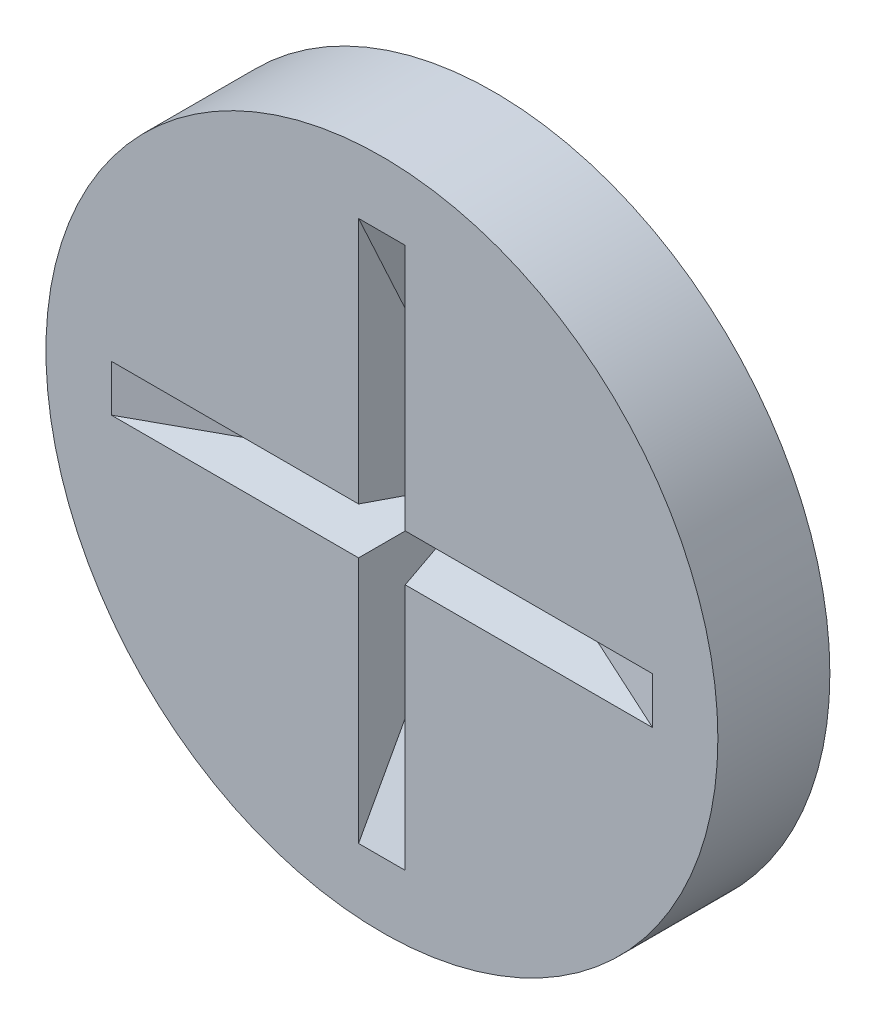
ISO-10303-21;
HEADER;
FILE_DESCRIPTION(('STEP AP214'),'2;1');
FILE_NAME('part.step','',(''),(''),'','','');
FILE_SCHEMA(('AUTOMOTIVE_DESIGN { 1 0 10303 214 1 1 1 1 }'));
ENDSEC;
DATA;
#1=APPLICATION_CONTEXT('core data for automotive mechanical design processes');
#2=APPLICATION_PROTOCOL_DEFINITION('international standard','automotive_design',2000,#1);
#3=PRODUCT_CONTEXT('',#1,'mechanical');
#4=PRODUCT('Part','Part','',(#3));
#5=PRODUCT_RELATED_PRODUCT_CATEGORY('part','',(#4));
#6=PRODUCT_DEFINITION_FORMATION('','',#4);
#7=PRODUCT_DEFINITION_CONTEXT('part definition',#1,'design');
#8=PRODUCT_DEFINITION('design','',#6,#7);
#9=PRODUCT_DEFINITION_SHAPE('','',#8);
#10=(LENGTH_UNIT() NAMED_UNIT(*) SI_UNIT(.MILLI.,.METRE.));
#11=(NAMED_UNIT(*) PLANE_ANGLE_UNIT() SI_UNIT($,.RADIAN.));
#12=(NAMED_UNIT(*) SI_UNIT($,.STERADIAN.) SOLID_ANGLE_UNIT());
#13=UNCERTAINTY_MEASURE_WITH_UNIT(LENGTH_MEASURE(1.E-05),#10,'distance_accuracy_value','');
#14=(GEOMETRIC_REPRESENTATION_CONTEXT(3) GLOBAL_UNCERTAINTY_ASSIGNED_CONTEXT((#13)) GLOBAL_UNIT_ASSIGNED_CONTEXT((#10,
#11,#12)) REPRESENTATION_CONTEXT('',''));
#15=CARTESIAN_POINT('',(0.,0.,0.));
#16=DIRECTION('',(0.,0.,1.));
#17=DIRECTION('',(1.,0.,0.));
#18=AXIS2_PLACEMENT_3D('',#15,#16,#17);
#19=CARTESIAN_POINT('',(0.,0.,1.2));
#20=DIRECTION('',(0.,0.,1.));
#21=DIRECTION('',(1.,0.,0.));
#22=AXIS2_PLACEMENT_3D('',#19,#20,#21);
#23=PLANE('',#22);
#24=CARTESIAN_POINT('',(0.,0.,1.2));
#25=DIRECTION('',(0.,0.,1.));
#26=DIRECTION('',(1.,0.,0.));
#27=AXIS2_PLACEMENT_3D('',#24,#25,#26);
#28=CIRCLE('',#27,3.6);
#29=CARTESIAN_POINT('',(3.6,0.,1.2));
#30=VERTEX_POINT('',#29);
#31=EDGE_CURVE('E48',#30,#30,#28,.T.);
#32=ORIENTED_EDGE('',*,*,#31,.T.);
#33=EDGE_LOOP('',(#32));
#34=FACE_BOUND('',#33,.T.);
#35=CARTESIAN_POINT('',(-2.9,0.25000000000001,1.2));
#36=DIRECTION('',(0.,-1.,0.));
#37=VECTOR('',#36,1.);
#38=LINE('',#35,#37);
#39=CARTESIAN_POINT('',(-2.9,0.25000000000001,1.2));
#40=VERTEX_POINT('',#39);
#41=CARTESIAN_POINT('',(-2.9,-0.24999999999999,1.2));
#42=VERTEX_POINT('',#41);
#43=EDGE_CURVE('E196',#40,#42,#38,.T.);
#44=ORIENTED_EDGE('',*,*,#43,.F.);
#45=DIRECTION('',(-1.,0.,0.));
#46=VECTOR('',#45,1.);
#47=CARTESIAN_POINT('',(2.9,0.24999999999999,1.2));
#48=LINE('',#47,#46);
#49=CARTESIAN_POINT('',(-0.249999999999998,0.250000000000002,1.2));
#50=VERTEX_POINT('',#49);
#51=EDGE_CURVE('E117',#50,#40,#48,.T.);
#52=ORIENTED_EDGE('',*,*,#51,.F.);
#53=DIRECTION('',(0.,-1.,0.));
#54=VECTOR('',#53,1.);
#55=CARTESIAN_POINT('',(-0.25,2.9,1.2));
#56=LINE('',#55,#54);
#57=CARTESIAN_POINT('',(-0.25,2.9,1.2));
#58=VERTEX_POINT('',#57);
#59=EDGE_CURVE('E150',#58,#50,#56,.T.);
#60=ORIENTED_EDGE('',*,*,#59,.F.);
#61=DIRECTION('',(-1.,0.,0.));
#62=VECTOR('',#61,1.);
#63=CARTESIAN_POINT('',(-0.25,2.9,1.2));
#64=LINE('',#63,#62);
#65=CARTESIAN_POINT('',(0.25,2.9,1.2));
#66=VERTEX_POINT('',#65);
#67=EDGE_CURVE('E126',#66,#58,#64,.T.);
#68=ORIENTED_EDGE('',*,*,#67,.F.);
#69=DIRECTION('',(0.,1.,0.));
#70=VECTOR('',#69,1.);
#71=CARTESIAN_POINT('',(0.25,2.9,1.2));
#72=LINE('',#71,#70);
#73=CARTESIAN_POINT('',(0.250000000000002,0.249999999999997,1.2));
#74=VERTEX_POINT('',#73);
#75=EDGE_CURVE('E65',#74,#66,#72,.T.);
#76=ORIENTED_EDGE('',*,*,#75,.F.);
#77=CARTESIAN_POINT('',(2.9,0.24999999999999,1.2));
#78=VERTEX_POINT('',#77);
#79=EDGE_CURVE('E110',#78,#74,#48,.T.);
#80=ORIENTED_EDGE('',*,*,#79,.F.);
#81=CARTESIAN_POINT('',(2.9,-0.25000000000001,1.2));
#82=DIRECTION('',(0.,1.,0.));
#83=VECTOR('',#82,1.);
#84=LINE('',#81,#83);
#85=CARTESIAN_POINT('',(2.9,-0.25000000000001,1.2));
#86=VERTEX_POINT('',#85);
#87=EDGE_CURVE('E204',#86,#78,#84,.T.);
#88=ORIENTED_EDGE('',*,*,#87,.F.);
#89=DIRECTION('',(1.,0.,0.));
#90=VECTOR('',#89,1.);
#91=CARTESIAN_POINT('',(2.9,-0.25000000000001,1.2));
#92=LINE('',#91,#90);
#93=CARTESIAN_POINT('',(0.249999999999999,-0.250000000000001,1.2));
#94=VERTEX_POINT('',#93);
#95=EDGE_CURVE('E213',#94,#86,#92,.T.);
#96=ORIENTED_EDGE('',*,*,#95,.F.);
#97=CARTESIAN_POINT('',(0.25,-2.9,1.2));
#98=VERTEX_POINT('',#97);
#99=EDGE_CURVE('E128',#98,#94,#72,.T.);
#100=ORIENTED_EDGE('',*,*,#99,.F.);
#101=DIRECTION('',(1.,0.,0.));
#102=VECTOR('',#101,1.);
#103=CARTESIAN_POINT('',(-0.25,-2.9,1.2));
#104=LINE('',#103,#102);
#105=CARTESIAN_POINT('',(-0.25,-2.9,1.2));
#106=VERTEX_POINT('',#105);
#107=EDGE_CURVE('E131',#106,#98,#104,.T.);
#108=ORIENTED_EDGE('',*,*,#107,.F.);
#109=CARTESIAN_POINT('',(-0.250000000000002,-0.249999999999997,1.2));
#110=VERTEX_POINT('',#109);
#111=EDGE_CURVE('E141',#110,#106,#56,.T.);
#112=ORIENTED_EDGE('',*,*,#111,.F.);
#113=EDGE_CURVE('E199',#42,#110,#92,.T.);
#114=ORIENTED_EDGE('',*,*,#113,.F.);
#115=EDGE_LOOP('',(#44,#52,#60,#68,#76,#80,#88,#96,#100,#108,#112,#114));
#116=FACE_BOUND('',#115,.T.);
#117=ADVANCED_FACE('F37',(#34,#116),#23,.T.);
#118=CARTESIAN_POINT('',(0.,0.,0.));
#119=DIRECTION('',(0.978980419737605,0.,0.203954254112001));
#120=DIRECTION('',(0.203954254112001,0.,-0.978980419737605));
#121=AXIS2_PLACEMENT_3D('',#118,#119,#120);
#122=PLANE('',#121);
#123=ORIENTED_EDGE('',*,*,#59,.T.);
#124=DIRECTION('',(0.199840191744356,-0.19984019174436,-0.959232920372918));
#125=VECTOR('',#124,1.);
#126=CARTESIAN_POINT('',(0.,0.,0.));
#127=LINE('',#126,#125);
#128=CARTESIAN_POINT('',(0.,0.,0.));
#129=VERTEX_POINT('',#128);
#130=EDGE_CURVE('E271',#50,#129,#127,.T.);
#131=ORIENTED_EDGE('',*,*,#130,.T.);
#132=DIRECTION('',(0.0794051021005356,-0.921099184366212,-0.38114449008257));
#133=VECTOR('',#132,1.);
#134=CARTESIAN_POINT('',(-0.25,2.9,1.2));
#135=LINE('',#134,#133);
#136=EDGE_CURVE('E134',#58,#129,#135,.T.);
#137=ORIENTED_EDGE('',*,*,#136,.F.);
#138=EDGE_LOOP('',(#123,#131,#137));
#139=FACE_BOUND('',#138,.T.);
#140=ADVANCED_FACE('F175',(#139),#122,.T.);
#141=DIRECTION('',(0.0794051021005354,0.921099184366212,-0.381144490082571));
#142=VECTOR('',#141,1.);
#143=CARTESIAN_POINT('',(-0.25,-2.9,1.2));
#144=LINE('',#143,#142);
#145=EDGE_CURVE('E129',#106,#129,#144,.T.);
#146=ORIENTED_EDGE('',*,*,#145,.T.);
#147=DIRECTION('',(-0.199840191744359,-0.199840191744356,0.959232920372918));
#148=VECTOR('',#147,1.);
#149=CARTESIAN_POINT('',(0.,0.,0.));
#150=LINE('',#149,#148);
#151=EDGE_CURVE('E267',#129,#110,#150,.T.);
#152=ORIENTED_EDGE('',*,*,#151,.T.);
#153=ORIENTED_EDGE('',*,*,#111,.T.);
#154=EDGE_LOOP('',(#146,#152,#153));
#155=FACE_BOUND('',#154,.T.);
#156=ADVANCED_FACE('F241',(#155),#122,.T.);
#157=CARTESIAN_POINT('',(0.,0.,0.));
#158=DIRECTION('',(-0.978980419737605,0.,0.203954254112001));
#159=DIRECTION('',(0.203954254112001,0.,0.978980419737605));
#160=AXIS2_PLACEMENT_3D('',#157,#158,#159);
#161=PLANE('',#160);
#162=DIRECTION('',(-0.0794051021005354,-0.921099184366212,-0.38114449008257));
#163=VECTOR('',#162,1.);
#164=CARTESIAN_POINT('',(0.25,2.9,1.2));
#165=LINE('',#164,#163);
#166=EDGE_CURVE('E120',#66,#129,#165,.T.);
#167=ORIENTED_EDGE('',*,*,#166,.T.);
#168=DIRECTION('',(0.199840191744359,0.199840191744356,0.959232920372918));
#169=VECTOR('',#168,1.);
#170=CARTESIAN_POINT('',(0.,0.,0.));
#171=LINE('',#170,#169);
#172=EDGE_CURVE('E112',#129,#74,#171,.T.);
#173=ORIENTED_EDGE('',*,*,#172,.T.);
#174=ORIENTED_EDGE('',*,*,#75,.T.);
#175=EDGE_LOOP('',(#167,#173,#174));
#176=FACE_BOUND('',#175,.T.);
#177=ADVANCED_FACE('F119',(#176),#161,.T.);
#178=ORIENTED_EDGE('',*,*,#99,.T.);
#179=DIRECTION('',(-0.199840191744356,0.19984019174436,-0.959232920372918));
#180=VECTOR('',#179,1.);
#181=CARTESIAN_POINT('',(0.,0.,0.));
#182=LINE('',#181,#180);
#183=EDGE_CURVE('E87',#94,#129,#182,.T.);
#184=ORIENTED_EDGE('',*,*,#183,.T.);
#185=DIRECTION('',(-0.0794051021005357,0.921099184366212,-0.381144490082571));
#186=VECTOR('',#185,1.);
#187=CARTESIAN_POINT('',(0.25,-2.9,1.2));
#188=LINE('',#187,#186);
#189=EDGE_CURVE('E56',#98,#129,#188,.T.);
#190=ORIENTED_EDGE('',*,*,#189,.F.);
#191=EDGE_LOOP('',(#178,#184,#190));
#192=FACE_BOUND('',#191,.T.);
#193=ADVANCED_FACE('F240',(#192),#161,.T.);
#194=CARTESIAN_POINT('',(0.,0.,0.));
#195=DIRECTION('',(0.,0.,1.));
#196=DIRECTION('',(1.,0.,0.));
#197=AXIS2_PLACEMENT_3D('',#194,#195,#196);
#198=PLANE('',#197);
#199=CARTESIAN_POINT('',(0.,0.,0.));
#200=DIRECTION('',(0.,0.,1.));
#201=DIRECTION('',(1.,0.,0.));
#202=AXIS2_PLACEMENT_3D('',#199,#200,#201);
#203=CIRCLE('',#202,3.6);
#204=CARTESIAN_POINT('',(3.6,0.,0.));
#205=VERTEX_POINT('',#204);
#206=EDGE_CURVE('E158',#205,#205,#203,.T.);
#207=ORIENTED_EDGE('',*,*,#206,.F.);
#208=EDGE_LOOP('',(#207));
#209=FACE_BOUND('',#208,.T.);
#210=CARTESIAN_POINT('',(0.,0.,0.));
#211=DIRECTION('',(0.,0.,1.));
#212=DIRECTION('',(1.,0.,0.));
#213=AXIS2_PLACEMENT_3D('',#210,#211,#212);
#214=CIRCLE('',#213,1.);
#215=CARTESIAN_POINT('',(1.,0.,0.));
#216=VERTEX_POINT('',#215);
#217=EDGE_CURVE('E12',#216,#216,#214,.F.);
#218=ORIENTED_EDGE('',*,*,#217,.F.);
#219=EDGE_LOOP('',(#218));
#220=FACE_BOUND('',#219,.T.);
#221=ADVANCED_FACE('F179',(#209,#220),#198,.F.);
#222=CARTESIAN_POINT('',(0.,0.,1.2));
#223=DIRECTION('',(0.,0.,-1.));
#224=DIRECTION('',(-1.,0.,0.));
#225=AXIS2_PLACEMENT_3D('',#222,#223,#224);
#226=CYLINDRICAL_SURFACE('',#225,3.6);
#227=ORIENTED_EDGE('',*,*,#31,.F.);
#228=EDGE_LOOP('',(#227));
#229=FACE_BOUND('',#228,.T.);
#230=ORIENTED_EDGE('',*,*,#206,.T.);
#231=EDGE_LOOP('',(#230));
#232=FACE_BOUND('',#231,.T.);
#233=ADVANCED_FACE('F39',(#229,#232),#226,.T.);
#234=CARTESIAN_POINT('',(0.,0.,-1.2));
#235=DIRECTION('',(0.,0.,1.));
#236=DIRECTION('',(1.,0.,0.));
#237=AXIS2_PLACEMENT_3D('',#234,#235,#236);
#238=CYLINDRICAL_SURFACE('',#237,1.);
#239=CARTESIAN_POINT('',(0.,0.,-1.2));
#240=DIRECTION('',(0.,0.,-1.));
#241=DIRECTION('',(-1.,0.,0.));
#242=AXIS2_PLACEMENT_3D('',#239,#240,#241);
#243=CIRCLE('',#242,1.);
#244=CARTESIAN_POINT('',(-1.,0.,-1.2));
#245=VERTEX_POINT('',#244);
#246=EDGE_CURVE('E149',#245,#245,#243,.T.);
#247=ORIENTED_EDGE('',*,*,#246,.F.);
#248=EDGE_LOOP('',(#247));
#249=FACE_BOUND('',#248,.T.);
#250=ORIENTED_EDGE('',*,*,#217,.T.);
#251=EDGE_LOOP('',(#250));
#252=FACE_BOUND('',#251,.T.);
#253=ADVANCED_FACE('F177',(#249,#252),#238,.T.);
#254=CARTESIAN_POINT('',(0.,0.,-1.2));
#255=DIRECTION('',(0.,0.,-1.));
#256=DIRECTION('',(-1.,0.,0.));
#257=AXIS2_PLACEMENT_3D('',#254,#255,#256);
#258=PLANE('',#257);
#259=ORIENTED_EDGE('',*,*,#246,.T.);
#260=EDGE_LOOP('',(#259));
#261=FACE_BOUND('',#260,.T.);
#262=ADVANCED_FACE('F236',(#261),#258,.T.);
#263=CARTESIAN_POINT('',(-0.25,-2.9,1.2));
#264=DIRECTION('',(0.,-0.3823517927263,-0.924016832421891));
#265=DIRECTION('',(0.,0.924016832421891,-0.3823517927263));
#266=AXIS2_PLACEMENT_3D('',#263,#264,#265);
#267=PLANE('',#266);
#268=ORIENTED_EDGE('',*,*,#145,.F.);
#269=ORIENTED_EDGE('',*,*,#107,.T.);
#270=ORIENTED_EDGE('',*,*,#189,.T.);
#271=EDGE_LOOP('',(#268,#269,#270));
#272=FACE_BOUND('',#271,.T.);
#273=ADVANCED_FACE('F235',(#272),#267,.F.);
#274=CARTESIAN_POINT('',(0.25,2.9,1.2));
#275=DIRECTION('',(0.,0.3823517927263,-0.924016832421891));
#276=DIRECTION('',(0.,0.924016832421891,0.3823517927263));
#277=AXIS2_PLACEMENT_3D('',#274,#275,#276);
#278=PLANE('',#277);
#279=ORIENTED_EDGE('',*,*,#166,.F.);
#280=ORIENTED_EDGE('',*,*,#67,.T.);
#281=ORIENTED_EDGE('',*,*,#136,.T.);
#282=EDGE_LOOP('',(#279,#280,#281));
#283=FACE_BOUND('',#282,.T.);
#284=ADVANCED_FACE('F225',(#283),#278,.F.);
#285=CARTESIAN_POINT('',(0.,0.,0.));
#286=DIRECTION('',(0.,-0.978980419737605,0.203954254112001));
#287=DIRECTION('',(0.,-0.203954254112001,-0.978980419737605));
#288=AXIS2_PLACEMENT_3D('',#285,#286,#287);
#289=PLANE('',#288);
#290=ORIENTED_EDGE('',*,*,#172,.F.);
#291=DIRECTION('',(-0.921099184366212,-0.0794051021005324,-0.38114449008257));
#292=VECTOR('',#291,1.);
#293=CARTESIAN_POINT('',(2.9,0.24999999999999,1.2));
#294=LINE('',#293,#292);
#295=EDGE_CURVE('E114',#78,#129,#294,.T.);
#296=ORIENTED_EDGE('',*,*,#295,.F.);
#297=ORIENTED_EDGE('',*,*,#79,.T.);
#298=EDGE_LOOP('',(#290,#296,#297));
#299=FACE_BOUND('',#298,.T.);
#300=ADVANCED_FACE('F111',(#299),#289,.T.);
#301=CARTESIAN_POINT('',(0.,0.,0.));
#302=DIRECTION('',(0.,0.978980419737605,0.203954254112001));
#303=DIRECTION('',(0.,-0.203954254112001,0.978980419737605));
#304=AXIS2_PLACEMENT_3D('',#301,#302,#303);
#305=PLANE('',#304);
#306=ORIENTED_EDGE('',*,*,#183,.F.);
#307=ORIENTED_EDGE('',*,*,#95,.T.);
#308=DIRECTION('',(-0.921099184366212,0.0794051021005386,-0.38114449008257));
#309=VECTOR('',#308,1.);
#310=CARTESIAN_POINT('',(2.9,-0.25000000000001,1.2));
#311=LINE('',#310,#309);
#312=EDGE_CURVE('E313',#86,#129,#311,.T.);
#313=ORIENTED_EDGE('',*,*,#312,.T.);
#314=EDGE_LOOP('',(#306,#307,#313));
#315=FACE_BOUND('',#314,.T.);
#316=ADVANCED_FACE('F296',(#315),#305,.T.);
#317=CARTESIAN_POINT('',(2.9,-0.25000000000001,1.2));
#318=DIRECTION('',(0.3823517927263,0.,-0.924016832421891));
#319=DIRECTION('',(0.924016832421891,0.,0.3823517927263));
#320=AXIS2_PLACEMENT_3D('',#317,#318,#319);
#321=PLANE('',#320);
#322=ORIENTED_EDGE('',*,*,#312,.F.);
#323=ORIENTED_EDGE('',*,*,#87,.T.);
#324=ORIENTED_EDGE('',*,*,#295,.T.);
#325=EDGE_LOOP('',(#322,#323,#324));
#326=FACE_BOUND('',#325,.T.);
#327=ADVANCED_FACE('F285',(#326),#321,.F.);
#328=ORIENTED_EDGE('',*,*,#130,.F.);
#329=ORIENTED_EDGE('',*,*,#51,.T.);
#330=DIRECTION('',(0.921099184366212,-0.0794051021005386,-0.381144490082571));
#331=VECTOR('',#330,1.);
#332=CARTESIAN_POINT('',(-2.9,0.25000000000001,1.2));
#333=LINE('',#332,#331);
#334=EDGE_CURVE('E78',#40,#129,#333,.T.);
#335=ORIENTED_EDGE('',*,*,#334,.T.);
#336=EDGE_LOOP('',(#328,#329,#335));
#337=FACE_BOUND('',#336,.T.);
#338=ADVANCED_FACE('F295',(#337),#289,.T.);
#339=ORIENTED_EDGE('',*,*,#151,.F.);
#340=DIRECTION('',(0.921099184366212,0.0794051021005324,-0.381144490082571));
#341=VECTOR('',#340,1.);
#342=CARTESIAN_POINT('',(-2.9,-0.24999999999999,1.2));
#343=LINE('',#342,#341);
#344=EDGE_CURVE('E268',#42,#129,#343,.T.);
#345=ORIENTED_EDGE('',*,*,#344,.F.);
#346=ORIENTED_EDGE('',*,*,#113,.T.);
#347=EDGE_LOOP('',(#339,#345,#346));
#348=FACE_BOUND('',#347,.T.);
#349=ADVANCED_FACE('F301',(#348),#305,.T.);
#350=CARTESIAN_POINT('',(-2.9,0.25000000000001,1.2));
#351=DIRECTION('',(-0.3823517927263,0.,-0.924016832421891));
#352=DIRECTION('',(0.924016832421891,0.,-0.3823517927263));
#353=AXIS2_PLACEMENT_3D('',#350,#351,#352);
#354=PLANE('',#353);
#355=ORIENTED_EDGE('',*,*,#334,.F.);
#356=ORIENTED_EDGE('',*,*,#43,.T.);
#357=ORIENTED_EDGE('',*,*,#344,.T.);
#358=EDGE_LOOP('',(#355,#356,#357));
#359=FACE_BOUND('',#358,.T.);
#360=ADVANCED_FACE('F297',(#359),#354,.F.);
#361=CLOSED_SHELL('',(#117,#140,#156,#177,#193,#221,#233,#253,#262,#273,#284,#300,#316,#327,
#338,#349,#360));
#362=MANIFOLD_SOLID_BREP('B2',#361);
#363=ADVANCED_BREP_SHAPE_REPRESENTATION('',(#18,#362),#14);
#364=SHAPE_DEFINITION_REPRESENTATION(#9,#363);
ENDSEC;
END-ISO-10303-21;
